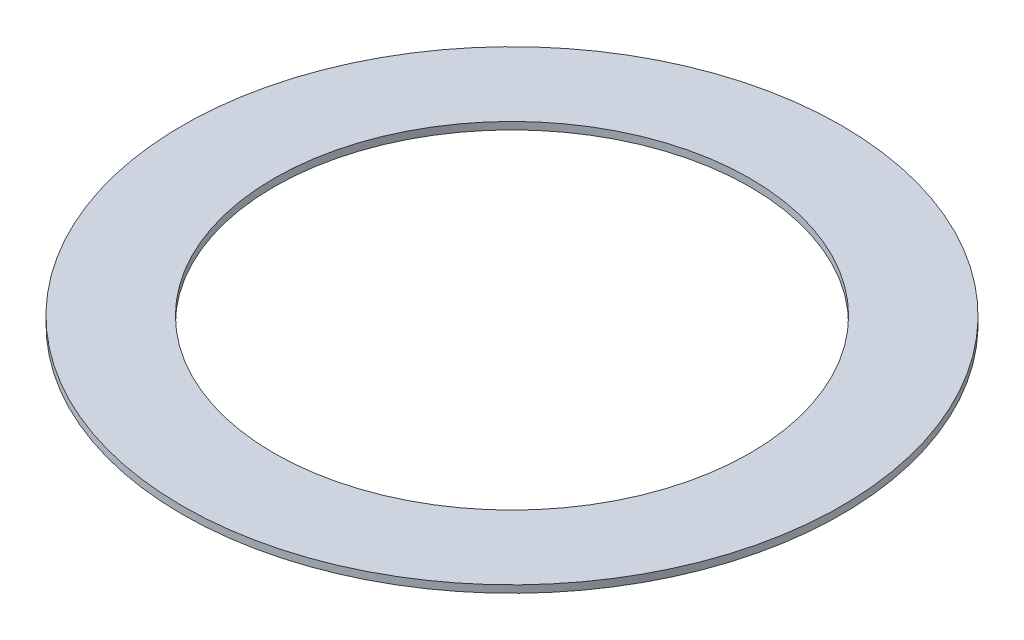
ISO-10303-21;
HEADER;
FILE_DESCRIPTION(('STEP AP214'),'2;1');
FILE_NAME('part.step','',(''),(''),'','','');
FILE_SCHEMA(('AUTOMOTIVE_DESIGN { 1 0 10303 214 1 1 1 1 }'));
ENDSEC;
DATA;
#1=APPLICATION_CONTEXT('core data for automotive mechanical design processes');
#2=APPLICATION_PROTOCOL_DEFINITION('international standard','automotive_design',2000,#1);
#3=PRODUCT_CONTEXT('',#1,'mechanical');
#4=PRODUCT('Part','Part','',(#3));
#5=PRODUCT_RELATED_PRODUCT_CATEGORY('part','',(#4));
#6=PRODUCT_DEFINITION_FORMATION('','',#4);
#7=PRODUCT_DEFINITION_CONTEXT('part definition',#1,'design');
#8=PRODUCT_DEFINITION('design','',#6,#7);
#9=PRODUCT_DEFINITION_SHAPE('','',#8);
#10=(LENGTH_UNIT() NAMED_UNIT(*) SI_UNIT(.MILLI.,.METRE.));
#11=(NAMED_UNIT(*) PLANE_ANGLE_UNIT() SI_UNIT($,.RADIAN.));
#12=(NAMED_UNIT(*) SI_UNIT($,.STERADIAN.) SOLID_ANGLE_UNIT());
#13=UNCERTAINTY_MEASURE_WITH_UNIT(LENGTH_MEASURE(1.E-05),#10,'distance_accuracy_value','');
#14=(GEOMETRIC_REPRESENTATION_CONTEXT(3) GLOBAL_UNCERTAINTY_ASSIGNED_CONTEXT((#13)) GLOBAL_UNIT_ASSIGNED_CONTEXT((#10,
#11,#12)) REPRESENTATION_CONTEXT('',''));
#15=CARTESIAN_POINT('',(0.,0.,0.));
#16=DIRECTION('',(0.,0.,1.));
#17=DIRECTION('',(1.,0.,0.));
#18=AXIS2_PLACEMENT_3D('',#15,#16,#17);
#19=CARTESIAN_POINT('',(0.,0.4,0.));
#20=DIRECTION('',(0.,-1.,0.));
#21=DIRECTION('',(0.,0.,-1.));
#22=AXIS2_PLACEMENT_3D('',#19,#20,#21);
#23=CYLINDRICAL_SURFACE('',#22,18.);
#24=CARTESIAN_POINT('',(0.,0.4,0.));
#25=DIRECTION('',(0.,1.,0.));
#26=DIRECTION('',(0.,0.,1.));
#27=AXIS2_PLACEMENT_3D('',#24,#25,#26);
#28=CIRCLE('',#27,18.);
#29=CARTESIAN_POINT('',(0.,0.4,18.));
#30=VERTEX_POINT('',#29);
#31=EDGE_CURVE('E10',#30,#30,#28,.T.);
#32=ORIENTED_EDGE('',*,*,#31,.F.);
#33=EDGE_LOOP('',(#32));
#34=FACE_BOUND('',#33,.T.);
#35=CARTESIAN_POINT('',(0.,0.,0.));
#36=DIRECTION('',(0.,1.,0.));
#37=DIRECTION('',(0.,0.,1.));
#38=AXIS2_PLACEMENT_3D('',#35,#36,#37);
#39=CIRCLE('',#38,18.);
#40=CARTESIAN_POINT('',(0.,0.,18.));
#41=VERTEX_POINT('',#40);
#42=EDGE_CURVE('E40',#41,#41,#39,.T.);
#43=ORIENTED_EDGE('',*,*,#42,.T.);
#44=EDGE_LOOP('',(#43));
#45=FACE_BOUND('',#44,.T.);
#46=ADVANCED_FACE('F37',(#34,#45),#23,.T.);
#47=CARTESIAN_POINT('',(0.,0.4,0.));
#48=DIRECTION('',(0.,1.,0.));
#49=DIRECTION('',(0.,0.,1.));
#50=AXIS2_PLACEMENT_3D('',#47,#48,#49);
#51=PLANE('',#50);
#52=CARTESIAN_POINT('',(0.,0.4,0.));
#53=DIRECTION('',(0.,1.,0.));
#54=DIRECTION('',(0.,0.,1.));
#55=AXIS2_PLACEMENT_3D('',#52,#53,#54);
#56=CIRCLE('',#55,13.);
#57=CARTESIAN_POINT('',(0.,0.4,13.));
#58=VERTEX_POINT('',#57);
#59=EDGE_CURVE('E51',#58,#58,#56,.T.);
#60=ORIENTED_EDGE('',*,*,#59,.F.);
#61=EDGE_LOOP('',(#60));
#62=FACE_BOUND('',#61,.T.);
#63=ORIENTED_EDGE('',*,*,#31,.T.);
#64=EDGE_LOOP('',(#63));
#65=FACE_BOUND('',#64,.T.);
#66=ADVANCED_FACE('F68',(#62,#65),#51,.T.);
#67=CARTESIAN_POINT('',(0.,0.,0.));
#68=DIRECTION('',(0.,1.,0.));
#69=DIRECTION('',(0.,0.,1.));
#70=AXIS2_PLACEMENT_3D('',#67,#68,#69);
#71=PLANE('',#70);
#72=CARTESIAN_POINT('',(0.,0.,0.));
#73=DIRECTION('',(0.,1.,0.));
#74=DIRECTION('',(0.,0.,1.));
#75=AXIS2_PLACEMENT_3D('',#72,#73,#74);
#76=CIRCLE('',#75,13.);
#77=CARTESIAN_POINT('',(0.,0.,13.));
#78=VERTEX_POINT('',#77);
#79=EDGE_CURVE('E49',#78,#78,#76,.T.);
#80=ORIENTED_EDGE('',*,*,#79,.T.);
#81=EDGE_LOOP('',(#80));
#82=FACE_BOUND('',#81,.T.);
#83=ORIENTED_EDGE('',*,*,#42,.F.);
#84=EDGE_LOOP('',(#83));
#85=FACE_BOUND('',#84,.T.);
#86=ADVANCED_FACE('F59',(#82,#85),#71,.F.);
#87=CARTESIAN_POINT('',(0.,0.,0.));
#88=DIRECTION('',(0.,1.,0.));
#89=DIRECTION('',(0.,0.,1.));
#90=AXIS2_PLACEMENT_3D('',#87,#88,#89);
#91=CYLINDRICAL_SURFACE('',#90,13.);
#92=ORIENTED_EDGE('',*,*,#79,.F.);
#93=EDGE_LOOP('',(#92));
#94=FACE_BOUND('',#93,.T.);
#95=ORIENTED_EDGE('',*,*,#59,.T.);
#96=EDGE_LOOP('',(#95));
#97=FACE_BOUND('',#96,.T.);
#98=ADVANCED_FACE('F62',(#94,#97),#91,.F.);
#99=CLOSED_SHELL('',(#46,#66,#86,#98));
#100=MANIFOLD_SOLID_BREP('B2',#99);
#101=ADVANCED_BREP_SHAPE_REPRESENTATION('',(#18,#100),#14);
#102=SHAPE_DEFINITION_REPRESENTATION(#9,#101);
ENDSEC;
END-ISO-10303-21;
